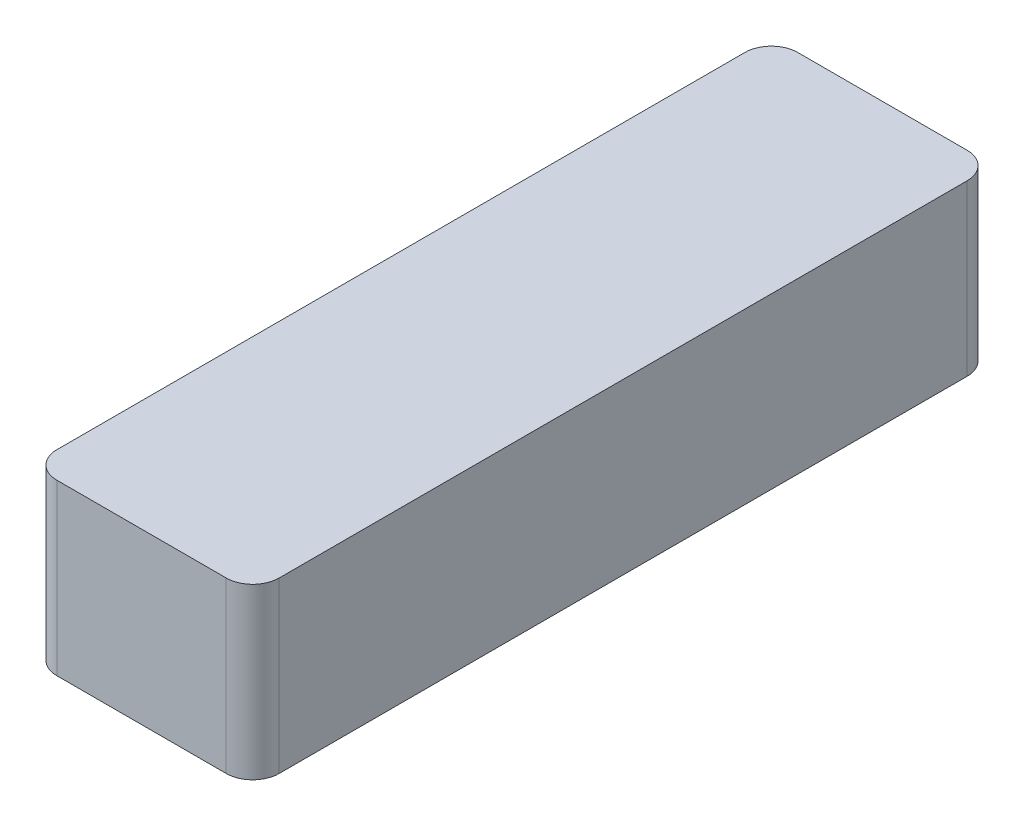
ISO-10303-21;
HEADER;
FILE_DESCRIPTION(('STEP AP214'),'2;1');
FILE_NAME('part.step','',(''),(''),'','','');
FILE_SCHEMA(('AUTOMOTIVE_DESIGN { 1 0 10303 214 1 1 1 1 }'));
ENDSEC;
DATA;
#1=APPLICATION_CONTEXT('core data for automotive mechanical design processes');
#2=APPLICATION_PROTOCOL_DEFINITION('international standard','automotive_design',2000,#1);
#3=PRODUCT_CONTEXT('',#1,'mechanical');
#4=PRODUCT('Part','Part','',(#3));
#5=PRODUCT_RELATED_PRODUCT_CATEGORY('part','',(#4));
#6=PRODUCT_DEFINITION_FORMATION('','',#4);
#7=PRODUCT_DEFINITION_CONTEXT('part definition',#1,'design');
#8=PRODUCT_DEFINITION('design','',#6,#7);
#9=PRODUCT_DEFINITION_SHAPE('','',#8);
#10=(LENGTH_UNIT() NAMED_UNIT(*) SI_UNIT(.MILLI.,.METRE.));
#11=(NAMED_UNIT(*) PLANE_ANGLE_UNIT() SI_UNIT($,.RADIAN.));
#12=(NAMED_UNIT(*) SI_UNIT($,.STERADIAN.) SOLID_ANGLE_UNIT());
#13=UNCERTAINTY_MEASURE_WITH_UNIT(LENGTH_MEASURE(1.E-05),#10,'distance_accuracy_value','');
#14=(GEOMETRIC_REPRESENTATION_CONTEXT(3) GLOBAL_UNCERTAINTY_ASSIGNED_CONTEXT((#13)) GLOBAL_UNIT_ASSIGNED_CONTEXT((#10,
#11,#12)) REPRESENTATION_CONTEXT('',''));
#15=CARTESIAN_POINT('',(0.,0.,0.));
#16=DIRECTION('',(0.,0.,1.));
#17=DIRECTION('',(1.,0.,0.));
#18=AXIS2_PLACEMENT_3D('',#15,#16,#17);
#19=CARTESIAN_POINT('',(21.,-16.,140.));
#20=DIRECTION('',(-1.,0.,0.));
#21=DIRECTION('',(0.,0.,1.));
#22=AXIS2_PLACEMENT_3D('',#19,#20,#21);
#23=PLANE('',#22);
#24=DIRECTION('',(0.,0.,-1.));
#25=VECTOR('',#24,1.);
#26=CARTESIAN_POINT('',(21.,-16.,140.));
#27=LINE('',#26,#25);
#28=CARTESIAN_POINT('',(21.,-16.,135.));
#29=VERTEX_POINT('',#28);
#30=CARTESIAN_POINT('',(21.,-16.,5.));
#31=VERTEX_POINT('',#30);
#32=EDGE_CURVE('E135',#29,#31,#27,.T.);
#33=ORIENTED_EDGE('',*,*,#32,.T.);
#34=DIRECTION('',(0.,1.,0.));
#35=VECTOR('',#34,1.);
#36=CARTESIAN_POINT('',(21.,16.,5.));
#37=LINE('',#36,#35);
#38=CARTESIAN_POINT('',(21.,16.,5.));
#39=VERTEX_POINT('',#38);
#40=EDGE_CURVE('E174',#31,#39,#37,.T.);
#41=ORIENTED_EDGE('',*,*,#40,.T.);
#42=DIRECTION('',(0.,0.,-1.));
#43=VECTOR('',#42,1.);
#44=CARTESIAN_POINT('',(21.,16.,140.));
#45=LINE('',#44,#43);
#46=CARTESIAN_POINT('',(21.,16.,135.));
#47=VERTEX_POINT('',#46);
#48=EDGE_CURVE('E141',#47,#39,#45,.T.);
#49=ORIENTED_EDGE('',*,*,#48,.F.);
#50=DIRECTION('',(0.,1.,0.));
#51=VECTOR('',#50,1.);
#52=CARTESIAN_POINT('',(21.,-16.,135.));
#53=LINE('',#52,#51);
#54=EDGE_CURVE('E171',#47,#29,#53,.F.);
#55=ORIENTED_EDGE('',*,*,#54,.T.);
#56=EDGE_LOOP('',(#33,#41,#49,#55));
#57=FACE_BOUND('',#56,.T.);
#58=ADVANCED_FACE('F44',(#57),#23,.F.);
#59=CARTESIAN_POINT('',(-21.,16.,140.));
#60=DIRECTION('',(0.,-1.,0.));
#61=DIRECTION('',(0.,0.,-1.));
#62=AXIS2_PLACEMENT_3D('',#59,#60,#61);
#63=PLANE('',#62);
#64=DIRECTION('',(-1.,0.,0.));
#65=VECTOR('',#64,1.);
#66=CARTESIAN_POINT('',(-21.,16.,0.));
#67=LINE('',#66,#65);
#68=CARTESIAN_POINT('',(16.,16.,0.));
#69=VERTEX_POINT('',#68);
#70=CARTESIAN_POINT('',(-16.,16.,0.));
#71=VERTEX_POINT('',#70);
#72=EDGE_CURVE('E194',#69,#71,#67,.T.);
#73=ORIENTED_EDGE('',*,*,#72,.T.);
#74=CARTESIAN_POINT('',(-16.,16.,5.));
#75=DIRECTION('',(0.,-1.,0.));
#76=DIRECTION('',(0.,0.,-1.));
#77=AXIS2_PLACEMENT_3D('',#74,#75,#76);
#78=CIRCLE('',#77,5.);
#79=CARTESIAN_POINT('',(-21.,16.,5.));
#80=VERTEX_POINT('',#79);
#81=EDGE_CURVE('E168',#71,#80,#78,.F.);
#82=ORIENTED_EDGE('',*,*,#81,.T.);
#83=DIRECTION('',(0.,0.,-1.));
#84=VECTOR('',#83,1.);
#85=CARTESIAN_POINT('',(-21.,16.,140.));
#86=LINE('',#85,#84);
#87=CARTESIAN_POINT('',(-21.,16.,135.));
#88=VERTEX_POINT('',#87);
#89=EDGE_CURVE('E134',#88,#80,#86,.T.);
#90=ORIENTED_EDGE('',*,*,#89,.F.);
#91=CARTESIAN_POINT('',(-16.,16.,135.));
#92=DIRECTION('',(0.,-1.,0.));
#93=DIRECTION('',(0.,0.,-1.));
#94=AXIS2_PLACEMENT_3D('',#91,#92,#93);
#95=CIRCLE('',#94,5.);
#96=CARTESIAN_POINT('',(-16.,16.,140.));
#97=VERTEX_POINT('',#96);
#98=EDGE_CURVE('E139',#88,#97,#95,.F.);
#99=ORIENTED_EDGE('',*,*,#98,.T.);
#100=DIRECTION('',(-1.,0.,0.));
#101=VECTOR('',#100,1.);
#102=CARTESIAN_POINT('',(-21.,16.,140.));
#103=LINE('',#102,#101);
#104=CARTESIAN_POINT('',(16.,16.,140.));
#105=VERTEX_POINT('',#104);
#106=EDGE_CURVE('E182',#105,#97,#103,.T.);
#107=ORIENTED_EDGE('',*,*,#106,.F.);
#108=CARTESIAN_POINT('',(16.,16.,135.));
#109=DIRECTION('',(0.,-1.,0.));
#110=DIRECTION('',(0.,0.,-1.));
#111=AXIS2_PLACEMENT_3D('',#108,#109,#110);
#112=CIRCLE('',#111,5.);
#113=EDGE_CURVE('E68',#105,#47,#112,.F.);
#114=ORIENTED_EDGE('',*,*,#113,.T.);
#115=ORIENTED_EDGE('',*,*,#48,.T.);
#116=CARTESIAN_POINT('',(16.,16.,5.));
#117=DIRECTION('',(0.,-1.,0.));
#118=DIRECTION('',(0.,0.,-1.));
#119=AXIS2_PLACEMENT_3D('',#116,#117,#118);
#120=CIRCLE('',#119,5.);
#121=EDGE_CURVE('E60',#39,#69,#120,.F.);
#122=ORIENTED_EDGE('',*,*,#121,.T.);
#123=EDGE_LOOP('',(#73,#82,#90,#99,#107,#114,#115,#122));
#124=FACE_BOUND('',#123,.T.);
#125=ADVANCED_FACE('F186',(#124),#63,.F.);
#126=CARTESIAN_POINT('',(-21.,-16.,140.));
#127=DIRECTION('',(1.,0.,0.));
#128=DIRECTION('',(0.,0.,-1.));
#129=AXIS2_PLACEMENT_3D('',#126,#127,#128);
#130=PLANE('',#129);
#131=ORIENTED_EDGE('',*,*,#89,.T.);
#132=DIRECTION('',(0.,-1.,0.));
#133=VECTOR('',#132,1.);
#134=CARTESIAN_POINT('',(-21.,-16.,5.));
#135=LINE('',#134,#133);
#136=CARTESIAN_POINT('',(-21.,-16.,5.));
#137=VERTEX_POINT('',#136);
#138=EDGE_CURVE('E132',#80,#137,#135,.T.);
#139=ORIENTED_EDGE('',*,*,#138,.T.);
#140=DIRECTION('',(0.,0.,-1.));
#141=VECTOR('',#140,1.);
#142=CARTESIAN_POINT('',(-21.,-16.,140.));
#143=LINE('',#142,#141);
#144=CARTESIAN_POINT('',(-21.,-16.,135.));
#145=VERTEX_POINT('',#144);
#146=EDGE_CURVE('E115',#145,#137,#143,.T.);
#147=ORIENTED_EDGE('',*,*,#146,.F.);
#148=DIRECTION('',(0.,-1.,0.));
#149=VECTOR('',#148,1.);
#150=CARTESIAN_POINT('',(-21.,-16.,135.));
#151=LINE('',#150,#149);
#152=EDGE_CURVE('E129',#145,#88,#151,.F.);
#153=ORIENTED_EDGE('',*,*,#152,.T.);
#154=EDGE_LOOP('',(#131,#139,#147,#153));
#155=FACE_BOUND('',#154,.T.);
#156=ADVANCED_FACE('F128',(#155),#130,.F.);
#157=CARTESIAN_POINT('',(-21.,-16.,140.));
#158=DIRECTION('',(0.,1.,0.));
#159=DIRECTION('',(0.,0.,1.));
#160=AXIS2_PLACEMENT_3D('',#157,#158,#159);
#161=PLANE('',#160);
#162=ORIENTED_EDGE('',*,*,#146,.T.);
#163=CARTESIAN_POINT('',(-16.,-16.,5.));
#164=DIRECTION('',(0.,1.,0.));
#165=DIRECTION('',(0.,0.,1.));
#166=AXIS2_PLACEMENT_3D('',#163,#164,#165);
#167=CIRCLE('',#166,5.);
#168=CARTESIAN_POINT('',(-16.,-16.,0.));
#169=VERTEX_POINT('',#168);
#170=EDGE_CURVE('E153',#137,#169,#167,.F.);
#171=ORIENTED_EDGE('',*,*,#170,.T.);
#172=DIRECTION('',(1.,0.,0.));
#173=VECTOR('',#172,1.);
#174=CARTESIAN_POINT('',(-21.,-16.,0.));
#175=LINE('',#174,#173);
#176=CARTESIAN_POINT('',(16.,-16.,0.));
#177=VERTEX_POINT('',#176);
#178=EDGE_CURVE('E188',#169,#177,#175,.T.);
#179=ORIENTED_EDGE('',*,*,#178,.T.);
#180=CARTESIAN_POINT('',(16.,-16.,5.));
#181=DIRECTION('',(0.,1.,0.));
#182=DIRECTION('',(0.,0.,1.));
#183=AXIS2_PLACEMENT_3D('',#180,#181,#182);
#184=CIRCLE('',#183,5.);
#185=EDGE_CURVE('E122',#177,#31,#184,.F.);
#186=ORIENTED_EDGE('',*,*,#185,.T.);
#187=ORIENTED_EDGE('',*,*,#32,.F.);
#188=CARTESIAN_POINT('',(16.,-16.,135.));
#189=DIRECTION('',(0.,1.,0.));
#190=DIRECTION('',(0.,0.,1.));
#191=AXIS2_PLACEMENT_3D('',#188,#189,#190);
#192=CIRCLE('',#191,5.);
#193=CARTESIAN_POINT('',(16.,-16.,140.));
#194=VERTEX_POINT('',#193);
#195=EDGE_CURVE('E123',#29,#194,#192,.F.);
#196=ORIENTED_EDGE('',*,*,#195,.T.);
#197=DIRECTION('',(1.,0.,0.));
#198=VECTOR('',#197,1.);
#199=CARTESIAN_POINT('',(-21.,-16.,140.));
#200=LINE('',#199,#198);
#201=CARTESIAN_POINT('',(-16.,-16.,140.));
#202=VERTEX_POINT('',#201);
#203=EDGE_CURVE('E117',#202,#194,#200,.T.);
#204=ORIENTED_EDGE('',*,*,#203,.F.);
#205=CARTESIAN_POINT('',(-16.,-16.,135.));
#206=DIRECTION('',(0.,1.,0.));
#207=DIRECTION('',(0.,0.,1.));
#208=AXIS2_PLACEMENT_3D('',#205,#206,#207);
#209=CIRCLE('',#208,5.);
#210=EDGE_CURVE('E112',#202,#145,#209,.F.);
#211=ORIENTED_EDGE('',*,*,#210,.T.);
#212=EDGE_LOOP('',(#162,#171,#179,#186,#187,#196,#204,#211));
#213=FACE_BOUND('',#212,.T.);
#214=ADVANCED_FACE('F114',(#213),#161,.F.);
#215=CARTESIAN_POINT('',(0.,0.,140.));
#216=DIRECTION('',(0.,0.,-1.));
#217=DIRECTION('',(-1.,0.,0.));
#218=AXIS2_PLACEMENT_3D('',#215,#216,#217);
#219=PLANE('',#218);
#220=ORIENTED_EDGE('',*,*,#106,.T.);
#221=DIRECTION('',(0.,-1.,0.));
#222=VECTOR('',#221,1.);
#223=CARTESIAN_POINT('',(-16.,0.,140.));
#224=LINE('',#223,#222);
#225=EDGE_CURVE('E11',#97,#202,#224,.T.);
#226=ORIENTED_EDGE('',*,*,#225,.T.);
#227=ORIENTED_EDGE('',*,*,#203,.T.);
#228=DIRECTION('',(0.,1.,0.));
#229=VECTOR('',#228,1.);
#230=CARTESIAN_POINT('',(16.,0.,140.));
#231=LINE('',#230,#229);
#232=EDGE_CURVE('E53',#194,#105,#231,.T.);
#233=ORIENTED_EDGE('',*,*,#232,.T.);
#234=EDGE_LOOP('',(#220,#226,#227,#233));
#235=FACE_BOUND('',#234,.T.);
#236=ADVANCED_FACE('F181',(#235),#219,.F.);
#237=CARTESIAN_POINT('',(0.,0.,0.));
#238=DIRECTION('',(0.,0.,-1.));
#239=DIRECTION('',(-1.,0.,0.));
#240=AXIS2_PLACEMENT_3D('',#237,#238,#239);
#241=PLANE('',#240);
#242=ORIENTED_EDGE('',*,*,#178,.F.);
#243=DIRECTION('',(0.,-1.,0.));
#244=VECTOR('',#243,1.);
#245=CARTESIAN_POINT('',(-16.,16.,0.));
#246=LINE('',#245,#244);
#247=EDGE_CURVE('E159',#169,#71,#246,.F.);
#248=ORIENTED_EDGE('',*,*,#247,.T.);
#249=ORIENTED_EDGE('',*,*,#72,.F.);
#250=DIRECTION('',(0.,1.,0.));
#251=VECTOR('',#250,1.);
#252=CARTESIAN_POINT('',(16.,-16.,0.));
#253=LINE('',#252,#251);
#254=EDGE_CURVE('E156',#69,#177,#253,.F.);
#255=ORIENTED_EDGE('',*,*,#254,.T.);
#256=EDGE_LOOP('',(#242,#248,#249,#255));
#257=FACE_BOUND('',#256,.T.);
#258=ADVANCED_FACE('F209',(#257),#241,.T.);
#259=CARTESIAN_POINT('',(-16.,-16.,5.));
#260=DIRECTION('',(0.,1.,0.));
#261=DIRECTION('',(0.,0.,1.));
#262=AXIS2_PLACEMENT_3D('',#259,#260,#261);
#263=CYLINDRICAL_SURFACE('',#262,5.);
#264=ORIENTED_EDGE('',*,*,#81,.F.);
#265=ORIENTED_EDGE('',*,*,#247,.F.);
#266=ORIENTED_EDGE('',*,*,#170,.F.);
#267=ORIENTED_EDGE('',*,*,#138,.F.);
#268=EDGE_LOOP('',(#264,#265,#266,#267));
#269=FACE_BOUND('',#268,.T.);
#270=ADVANCED_FACE('F204',(#269),#263,.T.);
#271=CARTESIAN_POINT('',(16.,-16.,5.));
#272=DIRECTION('',(0.,-1.,0.));
#273=DIRECTION('',(0.,0.,-1.));
#274=AXIS2_PLACEMENT_3D('',#271,#272,#273);
#275=CYLINDRICAL_SURFACE('',#274,5.);
#276=ORIENTED_EDGE('',*,*,#185,.F.);
#277=ORIENTED_EDGE('',*,*,#254,.F.);
#278=ORIENTED_EDGE('',*,*,#121,.F.);
#279=ORIENTED_EDGE('',*,*,#40,.F.);
#280=EDGE_LOOP('',(#276,#277,#278,#279));
#281=FACE_BOUND('',#280,.T.);
#282=ADVANCED_FACE('F211',(#281),#275,.T.);
#283=CARTESIAN_POINT('',(-16.,0.,135.));
#284=DIRECTION('',(0.,-1.,0.));
#285=DIRECTION('',(0.,0.,-1.));
#286=AXIS2_PLACEMENT_3D('',#283,#284,#285);
#287=CYLINDRICAL_SURFACE('',#286,5.);
#288=ORIENTED_EDGE('',*,*,#98,.F.);
#289=ORIENTED_EDGE('',*,*,#152,.F.);
#290=ORIENTED_EDGE('',*,*,#210,.F.);
#291=ORIENTED_EDGE('',*,*,#225,.F.);
#292=EDGE_LOOP('',(#288,#289,#290,#291));
#293=FACE_BOUND('',#292,.T.);
#294=ADVANCED_FACE('F138',(#293),#287,.T.);
#295=CARTESIAN_POINT('',(16.,0.,135.));
#296=DIRECTION('',(0.,1.,0.));
#297=DIRECTION('',(0.,0.,1.));
#298=AXIS2_PLACEMENT_3D('',#295,#296,#297);
#299=CYLINDRICAL_SURFACE('',#298,5.);
#300=ORIENTED_EDGE('',*,*,#195,.F.);
#301=ORIENTED_EDGE('',*,*,#54,.F.);
#302=ORIENTED_EDGE('',*,*,#113,.F.);
#303=ORIENTED_EDGE('',*,*,#232,.F.);
#304=EDGE_LOOP('',(#300,#301,#302,#303));
#305=FACE_BOUND('',#304,.T.);
#306=ADVANCED_FACE('F46',(#305),#299,.T.);
#307=CLOSED_SHELL('',(#58,#125,#156,#214,#236,#258,#270,#282,#294,#306));
#308=MANIFOLD_SOLID_BREP('B2',#307);
#309=ADVANCED_BREP_SHAPE_REPRESENTATION('',(#18,#308),#14);
#310=SHAPE_DEFINITION_REPRESENTATION(#9,#309);
ENDSEC;
END-ISO-10303-21;
